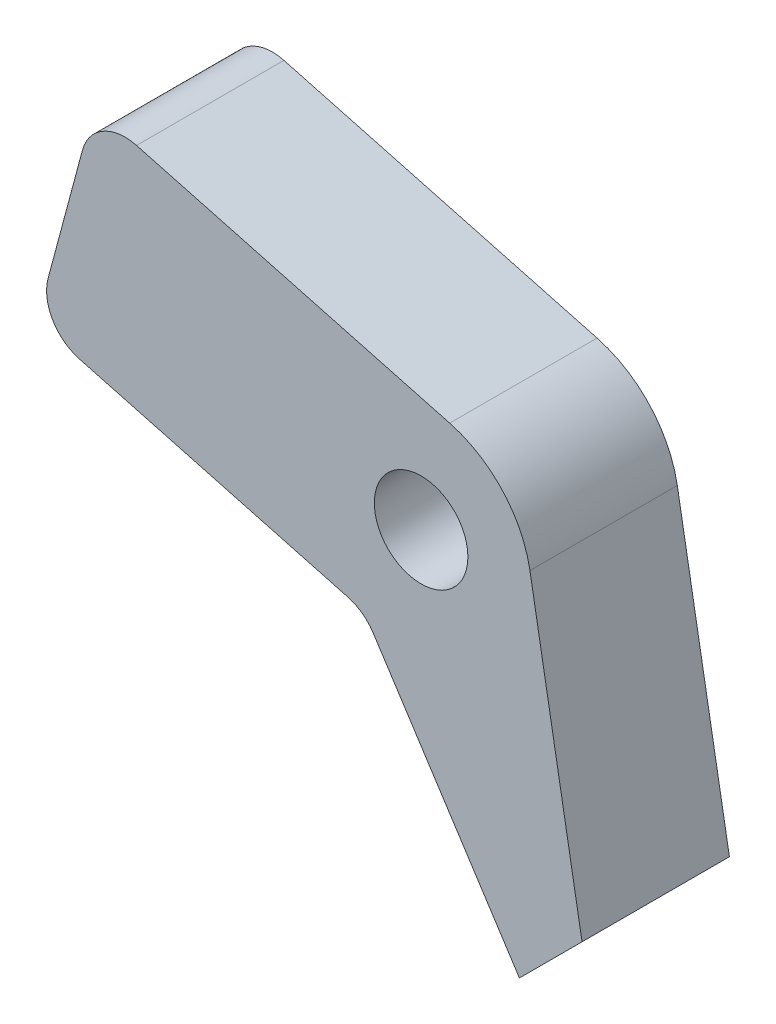
ISO-10303-21;
HEADER;
FILE_DESCRIPTION(('STEP AP214'),'2;1');
FILE_NAME('part.step','',(''),(''),'','','');
FILE_SCHEMA(('AUTOMOTIVE_DESIGN { 1 0 10303 214 1 1 1 1 }'));
ENDSEC;
DATA;
#1=APPLICATION_CONTEXT('core data for automotive mechanical design processes');
#2=APPLICATION_PROTOCOL_DEFINITION('international standard','automotive_design',2000,#1);
#3=PRODUCT_CONTEXT('',#1,'mechanical');
#4=PRODUCT('Part','Part','',(#3));
#5=PRODUCT_RELATED_PRODUCT_CATEGORY('part','',(#4));
#6=PRODUCT_DEFINITION_FORMATION('','',#4);
#7=PRODUCT_DEFINITION_CONTEXT('part definition',#1,'design');
#8=PRODUCT_DEFINITION('design','',#6,#7);
#9=PRODUCT_DEFINITION_SHAPE('','',#8);
#10=(LENGTH_UNIT() NAMED_UNIT(*) SI_UNIT(.MILLI.,.METRE.));
#11=(NAMED_UNIT(*) PLANE_ANGLE_UNIT() SI_UNIT($,.RADIAN.));
#12=(NAMED_UNIT(*) SI_UNIT($,.STERADIAN.) SOLID_ANGLE_UNIT());
#13=UNCERTAINTY_MEASURE_WITH_UNIT(LENGTH_MEASURE(1.E-05),#10,'distance_accuracy_value','');
#14=(GEOMETRIC_REPRESENTATION_CONTEXT(3) GLOBAL_UNCERTAINTY_ASSIGNED_CONTEXT((#13)) GLOBAL_UNIT_ASSIGNED_CONTEXT((#10,
#11,#12)) REPRESENTATION_CONTEXT('',''));
#15=CARTESIAN_POINT('',(0.,0.,0.));
#16=DIRECTION('',(0.,0.,1.));
#17=DIRECTION('',(1.,0.,0.));
#18=AXIS2_PLACEMENT_3D('',#15,#16,#17);
#19=CARTESIAN_POINT('',(7.38605814759157,1.30236133250193,10.));
#20=DIRECTION('',(0.984807753012209,0.173648177666924,0.));
#21=DIRECTION('',(-0.173648177666924,0.984807753012209,0.));
#22=AXIS2_PLACEMENT_3D('',#19,#20,#21);
#23=PLANE('',#22);
#24=DIRECTION('',(0.173648177666924,-0.984807753012209,0.));
#25=VECTOR('',#24,1.);
#26=CARTESIAN_POINT('',(7.38605814759157,1.30236133250193,0.));
#27=LINE('',#26,#25);
#28=CARTESIAN_POINT('',(7.38605814759157,1.30236133250193,0.));
#29=VERTEX_POINT('',#28);
#30=CARTESIAN_POINT('',(10.9217389909619,-18.7494811544757,0.));
#31=VERTEX_POINT('',#30);
#32=EDGE_CURVE('E132',#29,#31,#27,.T.);
#33=ORIENTED_EDGE('',*,*,#32,.F.);
#34=DIRECTION('',(0.,0.,-1.));
#35=VECTOR('',#34,1.);
#36=CARTESIAN_POINT('',(7.38605814759157,1.30236133250193,10.));
#37=LINE('',#36,#35);
#38=CARTESIAN_POINT('',(7.38605814759157,1.30236133250193,10.));
#39=VERTEX_POINT('',#38);
#40=EDGE_CURVE('E126',#39,#29,#37,.T.);
#41=ORIENTED_EDGE('',*,*,#40,.F.);
#42=DIRECTION('',(0.173648177666924,-0.984807753012209,0.));
#43=VECTOR('',#42,1.);
#44=CARTESIAN_POINT('',(7.38605814759157,1.30236133250193,10.));
#45=LINE('',#44,#43);
#46=CARTESIAN_POINT('',(10.9217389909619,-18.7494811544757,10.));
#47=VERTEX_POINT('',#46);
#48=EDGE_CURVE('E129',#39,#47,#45,.T.);
#49=ORIENTED_EDGE('',*,*,#48,.T.);
#50=DIRECTION('',(0.,0.,-1.));
#51=VECTOR('',#50,1.);
#52=CARTESIAN_POINT('',(10.9217389909619,-18.7494811544757,10.));
#53=LINE('',#52,#51);
#54=EDGE_CURVE('E178',#47,#31,#53,.T.);
#55=ORIENTED_EDGE('',*,*,#54,.T.);
#56=EDGE_LOOP('',(#33,#41,#49,#55));
#57=FACE_BOUND('',#56,.T.);
#58=ADVANCED_FACE('F47',(#57),#23,.T.);
#59=CARTESIAN_POINT('',(0.,0.,10.));
#60=DIRECTION('',(0.,0.,-1.));
#61=DIRECTION('',(-1.,0.,0.));
#62=AXIS2_PLACEMENT_3D('',#59,#60,#61);
#63=CYLINDRICAL_SURFACE('',#62,7.5);
#64=CARTESIAN_POINT('',(0.,0.,0.));
#65=DIRECTION('',(0.,0.,1.));
#66=DIRECTION('',(1.,0.,0.));
#67=AXIS2_PLACEMENT_3D('',#64,#65,#66);
#68=CIRCLE('',#67,7.5);
#69=CARTESIAN_POINT('',(1.94114283826886,7.24444369716802,0.));
#70=VERTEX_POINT('',#69);
#71=EDGE_CURVE('E181',#29,#70,#68,.T.);
#72=ORIENTED_EDGE('',*,*,#71,.T.);
#73=DIRECTION('',(0.,0.,-1.));
#74=VECTOR('',#73,1.);
#75=CARTESIAN_POINT('',(1.94114283826886,7.24444369716802,10.));
#76=LINE('',#75,#74);
#77=CARTESIAN_POINT('',(1.94114283826886,7.24444369716802,10.));
#78=VERTEX_POINT('',#77);
#79=EDGE_CURVE('E137',#78,#70,#76,.T.);
#80=ORIENTED_EDGE('',*,*,#79,.F.);
#81=CARTESIAN_POINT('',(0.,0.,10.));
#82=DIRECTION('',(0.,0.,1.));
#83=DIRECTION('',(1.,0.,0.));
#84=AXIS2_PLACEMENT_3D('',#81,#82,#83);
#85=CIRCLE('',#84,7.5);
#86=EDGE_CURVE('E140',#39,#78,#85,.T.);
#87=ORIENTED_EDGE('',*,*,#86,.F.);
#88=ORIENTED_EDGE('',*,*,#40,.T.);
#89=EDGE_LOOP('',(#72,#80,#87,#88));
#90=FACE_BOUND('',#89,.T.);
#91=ADVANCED_FACE('F141',(#90),#63,.T.);
#92=CARTESIAN_POINT('',(1.94114283826885,7.24444369716802,10.));
#93=DIRECTION('',(-0.258819045102514,-0.96592582628907,0.));
#94=DIRECTION('',(0.96592582628907,-0.258819045102514,0.));
#95=AXIS2_PLACEMENT_3D('',#92,#93,#94);
#96=PLANE('',#95);
#97=DIRECTION('',(-0.96592582628907,0.258819045102514,0.));
#98=VECTOR('',#97,1.);
#99=CARTESIAN_POINT('',(1.94114283826885,7.24444369716802,0.));
#100=LINE('',#99,#98);
#101=CARTESIAN_POINT('',(-19.3092253400907,12.9384626894233,0.));
#102=VERTEX_POINT('',#101);
#103=EDGE_CURVE('E184',#70,#102,#100,.T.);
#104=ORIENTED_EDGE('',*,*,#103,.T.);
#105=DIRECTION('',(0.,0.,-1.));
#106=VECTOR('',#105,1.);
#107=CARTESIAN_POINT('',(-19.3092253400907,12.9384626894233,10.));
#108=LINE('',#107,#106);
#109=CARTESIAN_POINT('',(-19.3092253400907,12.9384626894233,10.));
#110=VERTEX_POINT('',#109);
#111=EDGE_CURVE('E63',#102,#110,#108,.F.);
#112=ORIENTED_EDGE('',*,*,#111,.T.);
#113=DIRECTION('',(-0.96592582628907,0.258819045102514,0.));
#114=VECTOR('',#113,1.);
#115=CARTESIAN_POINT('',(1.94114283826885,7.24444369716802,10.));
#116=LINE('',#115,#114);
#117=EDGE_CURVE('E145',#78,#110,#116,.T.);
#118=ORIENTED_EDGE('',*,*,#117,.F.);
#119=ORIENTED_EDGE('',*,*,#79,.T.);
#120=EDGE_LOOP('',(#104,#112,#118,#119));
#121=FACE_BOUND('',#120,.T.);
#122=ADVANCED_FACE('F258',(#121),#96,.F.);
#123=CARTESIAN_POINT('',(-24.1481456572268,6.47047612756285,10.));
#124=DIRECTION('',(-0.96592582628907,0.258819045102514,0.));
#125=DIRECTION('',(-0.258819045102514,-0.96592582628907,0.));
#126=AXIS2_PLACEMENT_3D('',#123,#124,#125);
#127=PLANE('',#126);
#128=DIRECTION('',(0.258819045102514,0.96592582628907,0.));
#129=VECTOR('',#128,1.);
#130=CARTESIAN_POINT('',(-24.1481456572268,6.47047612756285,10.));
#131=LINE('',#130,#129);
#132=CARTESIAN_POINT('',(-25.3128313601881,2.12380990926205,10.));
#133=VERTEX_POINT('',#132);
#134=CARTESIAN_POINT('',(-22.9834599542654,10.8171423458637,10.));
#135=VERTEX_POINT('',#134);
#136=EDGE_CURVE('E161',#133,#135,#131,.T.);
#137=ORIENTED_EDGE('',*,*,#136,.T.);
#138=DIRECTION('',(0.,0.,-1.));
#139=VECTOR('',#138,1.);
#140=CARTESIAN_POINT('',(-22.9834599542654,10.8171423458637,0.));
#141=LINE('',#140,#139);
#142=CARTESIAN_POINT('',(-22.9834599542654,10.8171423458637,0.));
#143=VERTEX_POINT('',#142);
#144=EDGE_CURVE('E221',#135,#143,#141,.T.);
#145=ORIENTED_EDGE('',*,*,#144,.T.);
#146=DIRECTION('',(0.258819045102514,0.96592582628907,0.));
#147=VECTOR('',#146,1.);
#148=CARTESIAN_POINT('',(-24.1481456572268,6.47047612756285,0.));
#149=LINE('',#148,#147);
#150=CARTESIAN_POINT('',(-25.3128313601881,2.12380990926205,0.));
#151=VERTEX_POINT('',#150);
#152=EDGE_CURVE('E187',#151,#143,#149,.T.);
#153=ORIENTED_EDGE('',*,*,#152,.F.);
#154=DIRECTION('',(0.,0.,-1.));
#155=VECTOR('',#154,1.);
#156=CARTESIAN_POINT('',(-25.3128313601881,2.12380990926204,10.));
#157=LINE('',#156,#155);
#158=EDGE_CURVE('E218',#151,#133,#157,.F.);
#159=ORIENTED_EDGE('',*,*,#158,.T.);
#160=EDGE_LOOP('',(#137,#145,#153,#159));
#161=FACE_BOUND('',#160,.T.);
#162=ADVANCED_FACE('F266',(#161),#127,.T.);
#163=CARTESIAN_POINT('',(-1.94114283826886,-7.24444369716802,10.));
#164=DIRECTION('',(-0.258819045102514,-0.96592582628907,0.));
#165=DIRECTION('',(0.96592582628907,-0.258819045102514,0.));
#166=AXIS2_PLACEMENT_3D('',#163,#164,#165);
#167=PLANE('',#166);
#168=DIRECTION('',(-0.96592582628907,0.258819045102514,0.));
#169=VECTOR('',#168,1.);
#170=CARTESIAN_POINT('',(-1.94114283826886,-7.24444369716802,0.));
#171=LINE('',#170,#169);
#172=CARTESIAN_POINT('',(-4.98559810153509,-6.42868436798318,0.));
#173=VERTEX_POINT('',#172);
#174=CARTESIAN_POINT('',(-23.1915110166284,-1.55042470491271,0.));
#175=VERTEX_POINT('',#174);
#176=EDGE_CURVE('E190',#173,#175,#171,.T.);
#177=ORIENTED_EDGE('',*,*,#176,.F.);
#178=DIRECTION('',(0.,0.,-1.));
#179=VECTOR('',#178,1.);
#180=CARTESIAN_POINT('',(-4.98559810153509,-6.42868436798318,10.));
#181=LINE('',#180,#179);
#182=CARTESIAN_POINT('',(-4.98559810153509,-6.42868436798318,10.));
#183=VERTEX_POINT('',#182);
#184=EDGE_CURVE('E215',#173,#183,#181,.F.);
#185=ORIENTED_EDGE('',*,*,#184,.T.);
#186=DIRECTION('',(-0.96592582628907,0.258819045102514,0.));
#187=VECTOR('',#186,1.);
#188=CARTESIAN_POINT('',(-1.94114283826886,-7.24444369716802,10.));
#189=LINE('',#188,#187);
#190=CARTESIAN_POINT('',(-23.1915110166284,-1.55042470491271,10.));
#191=VERTEX_POINT('',#190);
#192=EDGE_CURVE('E165',#183,#191,#189,.T.);
#193=ORIENTED_EDGE('',*,*,#192,.T.);
#194=DIRECTION('',(0.,0.,-1.));
#195=VECTOR('',#194,1.);
#196=CARTESIAN_POINT('',(-23.1915110166284,-1.55042470491271,10.));
#197=LINE('',#196,#195);
#198=EDGE_CURVE('E211',#191,#175,#197,.T.);
#199=ORIENTED_EDGE('',*,*,#198,.T.);
#200=EDGE_LOOP('',(#177,#185,#193,#199));
#201=FACE_BOUND('',#200,.T.);
#202=ADVANCED_FACE('F246',(#201),#167,.T.);
#203=CARTESIAN_POINT('',(-5.79672089265198,-3.75552934693706,10.));
#204=DIRECTION('',(0.839259000302376,0.543731855248023,0.));
#205=DIRECTION('',(-0.543731855248023,0.839259000302376,0.));
#206=AXIS2_PLACEMENT_3D('',#203,#204,#205);
#207=PLANE('',#206);
#208=DIRECTION('',(0.543731855248023,-0.839259000302376,0.));
#209=VECTOR('',#208,1.);
#210=CARTESIAN_POINT('',(-5.79672089265198,-3.75552934693706,10.));
#211=LINE('',#210,#209);
#212=CARTESIAN_POINT('',(-3.2442782359355,-7.69526628110632,10.));
#213=VERTEX_POINT('',#212);
#214=CARTESIAN_POINT('',(6.67122014543762,-23.,10.));
#215=VERTEX_POINT('',#214);
#216=EDGE_CURVE('E169',#213,#215,#211,.T.);
#217=ORIENTED_EDGE('',*,*,#216,.F.);
#218=DIRECTION('',(0.,0.,-1.));
#219=VECTOR('',#218,1.);
#220=CARTESIAN_POINT('',(-3.2442782359355,-7.69526628110632,10.));
#221=LINE('',#220,#219);
#222=CARTESIAN_POINT('',(-3.2442782359355,-7.69526628110632,0.));
#223=VERTEX_POINT('',#222);
#224=EDGE_CURVE('E136',#213,#223,#221,.T.);
#225=ORIENTED_EDGE('',*,*,#224,.T.);
#226=DIRECTION('',(0.543731855248023,-0.839259000302376,0.));
#227=VECTOR('',#226,1.);
#228=CARTESIAN_POINT('',(-5.79672089265198,-3.75552934693706,0.));
#229=LINE('',#228,#227);
#230=CARTESIAN_POINT('',(6.67122014543762,-23.,0.));
#231=VERTEX_POINT('',#230);
#232=EDGE_CURVE('E194',#223,#231,#229,.T.);
#233=ORIENTED_EDGE('',*,*,#232,.T.);
#234=DIRECTION('',(0.,0.,-1.));
#235=VECTOR('',#234,1.);
#236=CARTESIAN_POINT('',(6.67122014543762,-23.,10.));
#237=LINE('',#236,#235);
#238=EDGE_CURVE('E202',#215,#231,#237,.T.);
#239=ORIENTED_EDGE('',*,*,#238,.F.);
#240=EDGE_LOOP('',(#217,#225,#233,#239));
#241=FACE_BOUND('',#240,.T.);
#242=ADVANCED_FACE('F254',(#241),#207,.F.);
#243=CARTESIAN_POINT('',(14.8356100727188,-14.8356100727189,10.));
#244=DIRECTION('',(0.707106781186544,-0.707106781186551,0.));
#245=DIRECTION('',(0.707106781186551,0.707106781186544,0.));
#246=AXIS2_PLACEMENT_3D('',#243,#244,#245);
#247=PLANE('',#246);
#248=DIRECTION('',(-0.707106781186551,-0.707106781186544,0.));
#249=VECTOR('',#248,1.);
#250=CARTESIAN_POINT('',(14.8356100727188,-14.8356100727189,0.));
#251=LINE('',#250,#249);
#252=EDGE_CURVE('E156',#31,#231,#251,.T.);
#253=ORIENTED_EDGE('',*,*,#252,.F.);
#254=ORIENTED_EDGE('',*,*,#54,.F.);
#255=DIRECTION('',(-0.707106781186551,-0.707106781186544,0.));
#256=VECTOR('',#255,1.);
#257=CARTESIAN_POINT('',(14.8356100727188,-14.8356100727189,10.));
#258=LINE('',#257,#256);
#259=EDGE_CURVE('E150',#47,#215,#258,.T.);
#260=ORIENTED_EDGE('',*,*,#259,.T.);
#261=ORIENTED_EDGE('',*,*,#238,.T.);
#262=EDGE_LOOP('',(#253,#254,#260,#261));
#263=FACE_BOUND('',#262,.T.);
#264=ADVANCED_FACE('F257',(#263),#247,.T.);
#265=CARTESIAN_POINT('',(0.,0.,10.));
#266=DIRECTION('',(0.,0.,-1.));
#267=DIRECTION('',(-1.,0.,0.));
#268=AXIS2_PLACEMENT_3D('',#265,#266,#267);
#269=CYLINDRICAL_SURFACE('',#268,3.175);
#270=CARTESIAN_POINT('',(0.,0.,10.));
#271=DIRECTION('',(0.,0.,1.));
#272=DIRECTION('',(1.,0.,0.));
#273=AXIS2_PLACEMENT_3D('',#270,#271,#272);
#274=CIRCLE('',#273,3.175);
#275=CARTESIAN_POINT('',(3.175,0.,10.));
#276=VERTEX_POINT('',#275);
#277=EDGE_CURVE('E174',#276,#276,#274,.T.);
#278=ORIENTED_EDGE('',*,*,#277,.T.);
#279=EDGE_LOOP('',(#278));
#280=FACE_BOUND('',#279,.T.);
#281=CARTESIAN_POINT('',(0.,0.,0.));
#282=DIRECTION('',(0.,0.,1.));
#283=DIRECTION('',(1.,0.,0.));
#284=AXIS2_PLACEMENT_3D('',#281,#282,#283);
#285=CIRCLE('',#284,3.175);
#286=CARTESIAN_POINT('',(3.175,0.,0.));
#287=VERTEX_POINT('',#286);
#288=EDGE_CURVE('E152',#287,#287,#285,.T.);
#289=ORIENTED_EDGE('',*,*,#288,.F.);
#290=EDGE_LOOP('',(#289));
#291=FACE_BOUND('',#290,.T.);
#292=ADVANCED_FACE('F290',(#280,#291),#269,.F.);
#293=CARTESIAN_POINT('',(0.,0.,10.));
#294=DIRECTION('',(0.,0.,1.));
#295=DIRECTION('',(1.,0.,0.));
#296=AXIS2_PLACEMENT_3D('',#293,#294,#295);
#297=PLANE('',#296);
#298=ORIENTED_EDGE('',*,*,#117,.T.);
#299=CARTESIAN_POINT('',(-20.0856824753982,10.0406852105561,10.));
#300=DIRECTION('',(0.,0.,1.));
#301=DIRECTION('',(1.,0.,0.));
#302=AXIS2_PLACEMENT_3D('',#299,#300,#301);
#303=CIRCLE('',#302,3.);
#304=EDGE_CURVE('E235',#110,#135,#303,.T.);
#305=ORIENTED_EDGE('',*,*,#304,.T.);
#306=ORIENTED_EDGE('',*,*,#136,.F.);
#307=CARTESIAN_POINT('',(-22.4150538813209,1.3473527739545,10.));
#308=DIRECTION('',(0.,0.,1.));
#309=DIRECTION('',(1.,0.,0.));
#310=AXIS2_PLACEMENT_3D('',#307,#308,#309);
#311=CIRCLE('',#310,3.);
#312=EDGE_CURVE('E232',#133,#191,#311,.T.);
#313=ORIENTED_EDGE('',*,*,#312,.T.);
#314=ORIENTED_EDGE('',*,*,#192,.F.);
#315=CARTESIAN_POINT('',(-5.76205523684263,-9.32646184685039,10.));
#316=DIRECTION('',(0.,0.,1.));
#317=DIRECTION('',(1.,0.,0.));
#318=AXIS2_PLACEMENT_3D('',#315,#316,#317);
#319=CIRCLE('',#318,3.);
#320=EDGE_CURVE('E11',#183,#213,#319,.F.);
#321=ORIENTED_EDGE('',*,*,#320,.T.);
#322=ORIENTED_EDGE('',*,*,#216,.T.);
#323=ORIENTED_EDGE('',*,*,#259,.F.);
#324=ORIENTED_EDGE('',*,*,#48,.F.);
#325=ORIENTED_EDGE('',*,*,#86,.T.);
#326=EDGE_LOOP('',(#298,#305,#306,#313,#314,#321,#322,#323,#324,#325));
#327=FACE_BOUND('',#326,.T.);
#328=ORIENTED_EDGE('',*,*,#277,.F.);
#329=EDGE_LOOP('',(#328));
#330=FACE_BOUND('',#329,.T.);
#331=ADVANCED_FACE('F147',(#327,#330),#297,.T.);
#332=CARTESIAN_POINT('',(0.,0.,0.));
#333=DIRECTION('',(0.,0.,1.));
#334=DIRECTION('',(1.,0.,0.));
#335=AXIS2_PLACEMENT_3D('',#332,#333,#334);
#336=PLANE('',#335);
#337=ORIENTED_EDGE('',*,*,#152,.T.);
#338=CARTESIAN_POINT('',(-20.0856824753982,10.0406852105561,0.));
#339=DIRECTION('',(0.,0.,1.));
#340=DIRECTION('',(1.,0.,0.));
#341=AXIS2_PLACEMENT_3D('',#338,#339,#340);
#342=CIRCLE('',#341,3.);
#343=EDGE_CURVE('E71',#143,#102,#342,.F.);
#344=ORIENTED_EDGE('',*,*,#343,.T.);
#345=ORIENTED_EDGE('',*,*,#103,.F.);
#346=ORIENTED_EDGE('',*,*,#71,.F.);
#347=ORIENTED_EDGE('',*,*,#32,.T.);
#348=ORIENTED_EDGE('',*,*,#252,.T.);
#349=ORIENTED_EDGE('',*,*,#232,.F.);
#350=CARTESIAN_POINT('',(-5.76205523684263,-9.32646184685039,0.));
#351=DIRECTION('',(0.,0.,1.));
#352=DIRECTION('',(1.,0.,0.));
#353=AXIS2_PLACEMENT_3D('',#350,#351,#352);
#354=CIRCLE('',#353,3.);
#355=EDGE_CURVE('E56',#223,#173,#354,.T.);
#356=ORIENTED_EDGE('',*,*,#355,.T.);
#357=ORIENTED_EDGE('',*,*,#176,.T.);
#358=CARTESIAN_POINT('',(-22.4150538813209,1.3473527739545,0.));
#359=DIRECTION('',(0.,0.,1.));
#360=DIRECTION('',(1.,0.,0.));
#361=AXIS2_PLACEMENT_3D('',#358,#359,#360);
#362=CIRCLE('',#361,3.);
#363=EDGE_CURVE('E225',#175,#151,#362,.F.);
#364=ORIENTED_EDGE('',*,*,#363,.T.);
#365=EDGE_LOOP('',(#337,#344,#345,#346,#347,#348,#349,#356,#357,#364));
#366=FACE_BOUND('',#365,.T.);
#367=ORIENTED_EDGE('',*,*,#288,.T.);
#368=EDGE_LOOP('',(#367));
#369=FACE_BOUND('',#368,.T.);
#370=ADVANCED_FACE('F240',(#366,#369),#336,.F.);
#371=CARTESIAN_POINT('',(-5.76205523684263,-9.32646184685039,10.));
#372=DIRECTION('',(0.,0.,-1.));
#373=DIRECTION('',(-1.,0.,0.));
#374=AXIS2_PLACEMENT_3D('',#371,#372,#373);
#375=CYLINDRICAL_SURFACE('',#374,3.);
#376=ORIENTED_EDGE('',*,*,#320,.F.);
#377=ORIENTED_EDGE('',*,*,#184,.F.);
#378=ORIENTED_EDGE('',*,*,#355,.F.);
#379=ORIENTED_EDGE('',*,*,#224,.F.);
#380=EDGE_LOOP('',(#376,#377,#378,#379));
#381=FACE_BOUND('',#380,.T.);
#382=ADVANCED_FACE('F250',(#381),#375,.F.);
#383=CARTESIAN_POINT('',(-20.0856824753982,10.0406852105561,10.));
#384=DIRECTION('',(0.,0.,1.));
#385=DIRECTION('',(1.,0.,0.));
#386=AXIS2_PLACEMENT_3D('',#383,#384,#385);
#387=CYLINDRICAL_SURFACE('',#386,3.);
#388=ORIENTED_EDGE('',*,*,#304,.F.);
#389=ORIENTED_EDGE('',*,*,#111,.F.);
#390=ORIENTED_EDGE('',*,*,#343,.F.);
#391=ORIENTED_EDGE('',*,*,#144,.F.);
#392=EDGE_LOOP('',(#388,#389,#390,#391));
#393=FACE_BOUND('',#392,.T.);
#394=ADVANCED_FACE('F263',(#393),#387,.T.);
#395=CARTESIAN_POINT('',(-22.4150538813209,1.3473527739545,10.));
#396=DIRECTION('',(0.,0.,-1.));
#397=DIRECTION('',(-1.,0.,0.));
#398=AXIS2_PLACEMENT_3D('',#395,#396,#397);
#399=CYLINDRICAL_SURFACE('',#398,3.);
#400=ORIENTED_EDGE('',*,*,#312,.F.);
#401=ORIENTED_EDGE('',*,*,#158,.F.);
#402=ORIENTED_EDGE('',*,*,#363,.F.);
#403=ORIENTED_EDGE('',*,*,#198,.F.);
#404=EDGE_LOOP('',(#400,#401,#402,#403));
#405=FACE_BOUND('',#404,.T.);
#406=ADVANCED_FACE('F49',(#405),#399,.T.);
#407=CLOSED_SHELL('',(#58,#91,#122,#162,#202,#242,#264,#292,#331,#370,#382,#394,#406));
#408=MANIFOLD_SOLID_BREP('B2',#407);
#409=ADVANCED_BREP_SHAPE_REPRESENTATION('',(#18,#408),#14);
#410=SHAPE_DEFINITION_REPRESENTATION(#9,#409);
ENDSEC;
END-ISO-10303-21;
